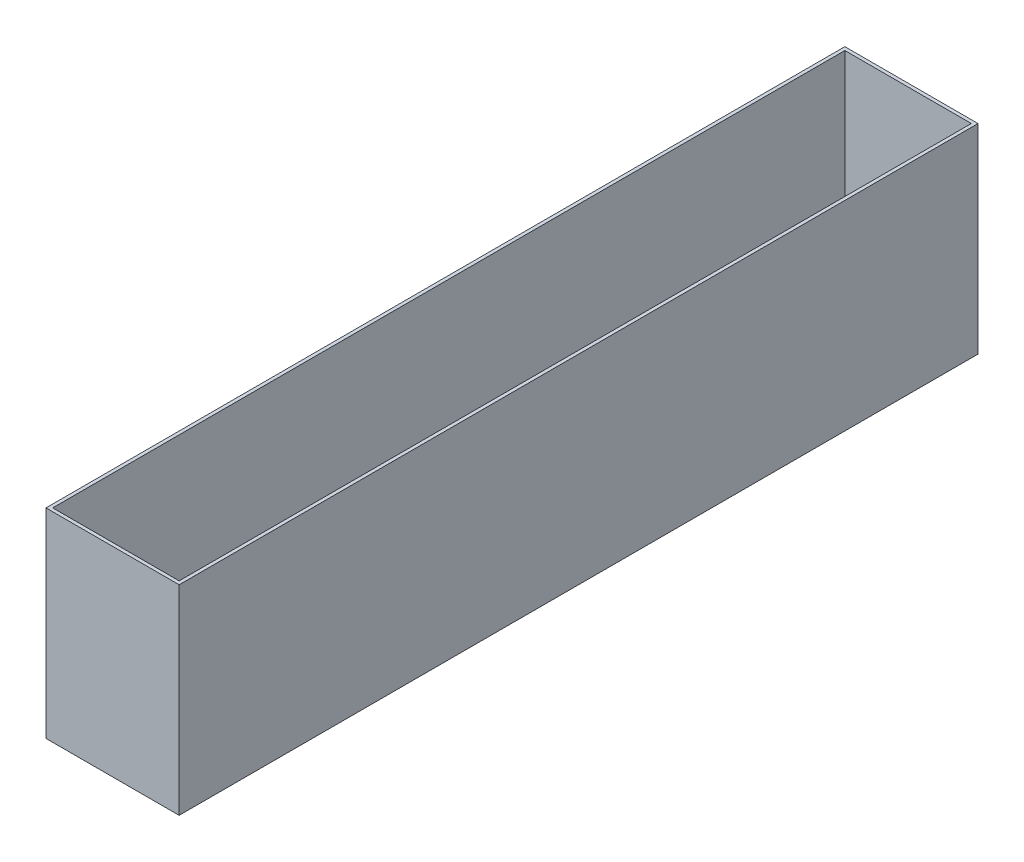
ISO-10303-21;
HEADER;
FILE_DESCRIPTION(('STEP AP214'),'2;1');
FILE_NAME('part.step','',(''),(''),'','','');
FILE_SCHEMA(('AUTOMOTIVE_DESIGN { 1 0 10303 214 1 1 1 1 }'));
ENDSEC;
DATA;
#1=APPLICATION_CONTEXT('core data for automotive mechanical design processes');
#2=APPLICATION_PROTOCOL_DEFINITION('international standard','automotive_design',2000,#1);
#3=PRODUCT_CONTEXT('',#1,'mechanical');
#4=PRODUCT('Part','Part','',(#3));
#5=PRODUCT_RELATED_PRODUCT_CATEGORY('part','',(#4));
#6=PRODUCT_DEFINITION_FORMATION('','',#4);
#7=PRODUCT_DEFINITION_CONTEXT('part definition',#1,'design');
#8=PRODUCT_DEFINITION('design','',#6,#7);
#9=PRODUCT_DEFINITION_SHAPE('','',#8);
#10=(LENGTH_UNIT() NAMED_UNIT(*) SI_UNIT(.MILLI.,.METRE.));
#11=(NAMED_UNIT(*) PLANE_ANGLE_UNIT() SI_UNIT($,.RADIAN.));
#12=(NAMED_UNIT(*) SI_UNIT($,.STERADIAN.) SOLID_ANGLE_UNIT());
#13=UNCERTAINTY_MEASURE_WITH_UNIT(LENGTH_MEASURE(1.E-05),#10,'distance_accuracy_value','');
#14=(GEOMETRIC_REPRESENTATION_CONTEXT(3) GLOBAL_UNCERTAINTY_ASSIGNED_CONTEXT((#13)) GLOBAL_UNIT_ASSIGNED_CONTEXT((#10,
#11,#12)) REPRESENTATION_CONTEXT('',''));
#15=CARTESIAN_POINT('',(0.,0.,0.));
#16=DIRECTION('',(0.,0.,1.));
#17=DIRECTION('',(1.,0.,0.));
#18=AXIS2_PLACEMENT_3D('',#15,#16,#17);
#19=CARTESIAN_POINT('',(0.,300.,0.));
#20=DIRECTION('',(1.,0.,0.));
#21=DIRECTION('',(0.,0.,-1.));
#22=AXIS2_PLACEMENT_3D('',#19,#20,#21);
#23=PLANE('',#22);
#24=DIRECTION('',(0.,0.,1.));
#25=VECTOR('',#24,1.);
#26=CARTESIAN_POINT('',(0.,0.,0.));
#27=LINE('',#26,#25);
#28=CARTESIAN_POINT('',(0.,0.,0.));
#29=VERTEX_POINT('',#28);
#30=CARTESIAN_POINT('',(1.46957615897682E-13,0.,1200.));
#31=VERTEX_POINT('',#30);
#32=EDGE_CURVE('E142',#29,#31,#27,.T.);
#33=ORIENTED_EDGE('',*,*,#32,.T.);
#34=DIRECTION('',(0.,-1.,0.));
#35=VECTOR('',#34,1.);
#36=CARTESIAN_POINT('',(1.46957615897682E-13,300.,1200.));
#37=LINE('',#36,#35);
#38=CARTESIAN_POINT('',(1.46957615897682E-13,300.,1200.));
#39=VERTEX_POINT('',#38);
#40=EDGE_CURVE('E11',#39,#31,#37,.T.);
#41=ORIENTED_EDGE('',*,*,#40,.F.);
#42=DIRECTION('',(0.,0.,1.));
#43=VECTOR('',#42,1.);
#44=CARTESIAN_POINT('',(0.,300.,0.));
#45=LINE('',#44,#43);
#46=CARTESIAN_POINT('',(0.,300.,0.));
#47=VERTEX_POINT('',#46);
#48=EDGE_CURVE('E146',#47,#39,#45,.T.);
#49=ORIENTED_EDGE('',*,*,#48,.F.);
#50=DIRECTION('',(0.,-1.,0.));
#51=VECTOR('',#50,1.);
#52=CARTESIAN_POINT('',(0.,300.,0.));
#53=LINE('',#52,#51);
#54=EDGE_CURVE('E152',#47,#29,#53,.T.);
#55=ORIENTED_EDGE('',*,*,#54,.T.);
#56=EDGE_LOOP('',(#33,#41,#49,#55));
#57=FACE_BOUND('',#56,.T.);
#58=ADVANCED_FACE('F34',(#57),#23,.F.);
#59=CARTESIAN_POINT('',(1.46957615897682E-13,300.,1200.));
#60=DIRECTION('',(0.,0.,-1.));
#61=DIRECTION('',(-1.,0.,0.));
#62=AXIS2_PLACEMENT_3D('',#59,#60,#61);
#63=PLANE('',#62);
#64=DIRECTION('',(1.,0.,0.));
#65=VECTOR('',#64,1.);
#66=CARTESIAN_POINT('',(1.46957615897682E-13,0.,1200.));
#67=LINE('',#66,#65);
#68=CARTESIAN_POINT('',(200.,0.,1200.));
#69=VERTEX_POINT('',#68);
#70=EDGE_CURVE('E155',#31,#69,#67,.T.);
#71=ORIENTED_EDGE('',*,*,#70,.T.);
#72=DIRECTION('',(0.,-1.,0.));
#73=VECTOR('',#72,1.);
#74=CARTESIAN_POINT('',(200.,300.,1200.));
#75=LINE('',#74,#73);
#76=CARTESIAN_POINT('',(200.,300.,1200.));
#77=VERTEX_POINT('',#76);
#78=EDGE_CURVE('E41',#77,#69,#75,.T.);
#79=ORIENTED_EDGE('',*,*,#78,.F.);
#80=DIRECTION('',(1.,0.,0.));
#81=VECTOR('',#80,1.);
#82=CARTESIAN_POINT('',(1.46957615897682E-13,300.,1200.));
#83=LINE('',#82,#81);
#84=EDGE_CURVE('E85',#39,#77,#83,.T.);
#85=ORIENTED_EDGE('',*,*,#84,.F.);
#86=ORIENTED_EDGE('',*,*,#40,.T.);
#87=EDGE_LOOP('',(#71,#79,#85,#86));
#88=FACE_BOUND('',#87,.T.);
#89=ADVANCED_FACE('F184',(#88),#63,.F.);
#90=CARTESIAN_POINT('',(200.,300.,0.));
#91=DIRECTION('',(-1.,0.,0.));
#92=DIRECTION('',(0.,0.,1.));
#93=AXIS2_PLACEMENT_3D('',#90,#91,#92);
#94=PLANE('',#93);
#95=DIRECTION('',(0.,0.,-1.));
#96=VECTOR('',#95,1.);
#97=CARTESIAN_POINT('',(200.,0.,0.));
#98=LINE('',#97,#96);
#99=CARTESIAN_POINT('',(200.,0.,0.));
#100=VERTEX_POINT('',#99);
#101=EDGE_CURVE('E157',#69,#100,#98,.T.);
#102=ORIENTED_EDGE('',*,*,#101,.T.);
#103=DIRECTION('',(0.,-1.,0.));
#104=VECTOR('',#103,1.);
#105=CARTESIAN_POINT('',(200.,300.,0.));
#106=LINE('',#105,#104);
#107=CARTESIAN_POINT('',(200.,300.,0.));
#108=VERTEX_POINT('',#107);
#109=EDGE_CURVE('E161',#108,#100,#106,.T.);
#110=ORIENTED_EDGE('',*,*,#109,.F.);
#111=DIRECTION('',(0.,0.,-1.));
#112=VECTOR('',#111,1.);
#113=CARTESIAN_POINT('',(200.,300.,0.));
#114=LINE('',#113,#112);
#115=EDGE_CURVE('E149',#77,#108,#114,.T.);
#116=ORIENTED_EDGE('',*,*,#115,.F.);
#117=ORIENTED_EDGE('',*,*,#78,.T.);
#118=EDGE_LOOP('',(#102,#110,#116,#117));
#119=FACE_BOUND('',#118,.T.);
#120=ADVANCED_FACE('F166',(#119),#94,.F.);
#121=CARTESIAN_POINT('',(0.,300.,0.));
#122=DIRECTION('',(0.,0.,1.));
#123=DIRECTION('',(1.,0.,0.));
#124=AXIS2_PLACEMENT_3D('',#121,#122,#123);
#125=PLANE('',#124);
#126=DIRECTION('',(-1.,0.,0.));
#127=VECTOR('',#126,1.);
#128=CARTESIAN_POINT('',(0.,0.,0.));
#129=LINE('',#128,#127);
#130=EDGE_CURVE('E78',#100,#29,#129,.T.);
#131=ORIENTED_EDGE('',*,*,#130,.T.);
#132=ORIENTED_EDGE('',*,*,#54,.F.);
#133=DIRECTION('',(-1.,0.,0.));
#134=VECTOR('',#133,1.);
#135=CARTESIAN_POINT('',(0.,300.,0.));
#136=LINE('',#135,#134);
#137=EDGE_CURVE('E57',#108,#47,#136,.T.);
#138=ORIENTED_EDGE('',*,*,#137,.F.);
#139=ORIENTED_EDGE('',*,*,#109,.T.);
#140=EDGE_LOOP('',(#131,#132,#138,#139));
#141=FACE_BOUND('',#140,.T.);
#142=ADVANCED_FACE('F174',(#141),#125,.F.);
#143=CARTESIAN_POINT('',(0.,300.,0.));
#144=DIRECTION('',(0.,1.,0.));
#145=DIRECTION('',(0.,0.,1.));
#146=AXIS2_PLACEMENT_3D('',#143,#144,#145);
#147=PLANE('',#146);
#148=DIRECTION('',(0.,0.,1.));
#149=VECTOR('',#148,1.);
#150=CARTESIAN_POINT('',(5.,300.,5.));
#151=LINE('',#150,#149);
#152=CARTESIAN_POINT('',(5.,300.,5.));
#153=VERTEX_POINT('',#152);
#154=CARTESIAN_POINT('',(5.00000000000015,300.,1195.));
#155=VERTEX_POINT('',#154);
#156=EDGE_CURVE('E48',#153,#155,#151,.T.);
#157=ORIENTED_EDGE('',*,*,#156,.F.);
#158=DIRECTION('',(-1.,0.,0.));
#159=VECTOR('',#158,1.);
#160=CARTESIAN_POINT('',(5.,300.,5.));
#161=LINE('',#160,#159);
#162=CARTESIAN_POINT('',(195.,300.,5.));
#163=VERTEX_POINT('',#162);
#164=EDGE_CURVE('E127',#163,#153,#161,.T.);
#165=ORIENTED_EDGE('',*,*,#164,.F.);
#166=DIRECTION('',(0.,0.,-1.));
#167=VECTOR('',#166,1.);
#168=CARTESIAN_POINT('',(195.,300.,5.));
#169=LINE('',#168,#167);
#170=CARTESIAN_POINT('',(195.,300.,1195.));
#171=VERTEX_POINT('',#170);
#172=EDGE_CURVE('E130',#171,#163,#169,.T.);
#173=ORIENTED_EDGE('',*,*,#172,.F.);
#174=DIRECTION('',(1.,0.,0.));
#175=VECTOR('',#174,1.);
#176=CARTESIAN_POINT('',(5.00000000000015,300.,1195.));
#177=LINE('',#176,#175);
#178=EDGE_CURVE('E136',#155,#171,#177,.T.);
#179=ORIENTED_EDGE('',*,*,#178,.F.);
#180=EDGE_LOOP('',(#157,#165,#173,#179));
#181=FACE_BOUND('',#180,.T.);
#182=ORIENTED_EDGE('',*,*,#48,.T.);
#183=ORIENTED_EDGE('',*,*,#84,.T.);
#184=ORIENTED_EDGE('',*,*,#115,.T.);
#185=ORIENTED_EDGE('',*,*,#137,.T.);
#186=EDGE_LOOP('',(#182,#183,#184,#185));
#187=FACE_BOUND('',#186,.T.);
#188=ADVANCED_FACE('F176',(#181,#187),#147,.T.);
#189=CARTESIAN_POINT('',(0.,0.,0.));
#190=DIRECTION('',(0.,1.,0.));
#191=DIRECTION('',(0.,0.,1.));
#192=AXIS2_PLACEMENT_3D('',#189,#190,#191);
#193=PLANE('',#192);
#194=ORIENTED_EDGE('',*,*,#32,.F.);
#195=ORIENTED_EDGE('',*,*,#130,.F.);
#196=ORIENTED_EDGE('',*,*,#101,.F.);
#197=ORIENTED_EDGE('',*,*,#70,.F.);
#198=EDGE_LOOP('',(#194,#195,#196,#197));
#199=FACE_BOUND('',#198,.T.);
#200=ADVANCED_FACE('F170',(#199),#193,.F.);
#201=CARTESIAN_POINT('',(5.,10.,5.));
#202=DIRECTION('',(-1.,0.,0.));
#203=DIRECTION('',(0.,0.,1.));
#204=AXIS2_PLACEMENT_3D('',#201,#202,#203);
#205=PLANE('',#204);
#206=ORIENTED_EDGE('',*,*,#156,.T.);
#207=DIRECTION('',(0.,1.,0.));
#208=VECTOR('',#207,1.);
#209=CARTESIAN_POINT('',(5.00000000000015,10.,1195.));
#210=LINE('',#209,#208);
#211=CARTESIAN_POINT('',(5.00000000000015,10.,1195.));
#212=VERTEX_POINT('',#211);
#213=EDGE_CURVE('E105',#212,#155,#210,.T.);
#214=ORIENTED_EDGE('',*,*,#213,.F.);
#215=DIRECTION('',(0.,0.,1.));
#216=VECTOR('',#215,1.);
#217=CARTESIAN_POINT('',(5.,10.,5.));
#218=LINE('',#217,#216);
#219=CARTESIAN_POINT('',(5.,10.,5.));
#220=VERTEX_POINT('',#219);
#221=EDGE_CURVE('E109',#220,#212,#218,.T.);
#222=ORIENTED_EDGE('',*,*,#221,.F.);
#223=DIRECTION('',(0.,1.,0.));
#224=VECTOR('',#223,1.);
#225=CARTESIAN_POINT('',(5.,10.,5.));
#226=LINE('',#225,#224);
#227=EDGE_CURVE('E140',#220,#153,#226,.T.);
#228=ORIENTED_EDGE('',*,*,#227,.T.);
#229=EDGE_LOOP('',(#206,#214,#222,#228));
#230=FACE_BOUND('',#229,.T.);
#231=ADVANCED_FACE('F107',(#230),#205,.F.);
#232=CARTESIAN_POINT('',(5.,10.,5.));
#233=DIRECTION('',(0.,0.,-1.));
#234=DIRECTION('',(-1.,0.,0.));
#235=AXIS2_PLACEMENT_3D('',#232,#233,#234);
#236=PLANE('',#235);
#237=ORIENTED_EDGE('',*,*,#164,.T.);
#238=ORIENTED_EDGE('',*,*,#227,.F.);
#239=DIRECTION('',(-1.,0.,0.));
#240=VECTOR('',#239,1.);
#241=CARTESIAN_POINT('',(5.,10.,5.));
#242=LINE('',#241,#240);
#243=CARTESIAN_POINT('',(195.,10.,5.));
#244=VERTEX_POINT('',#243);
#245=EDGE_CURVE('E115',#244,#220,#242,.T.);
#246=ORIENTED_EDGE('',*,*,#245,.F.);
#247=DIRECTION('',(0.,1.,0.));
#248=VECTOR('',#247,1.);
#249=CARTESIAN_POINT('',(195.,10.,5.));
#250=LINE('',#249,#248);
#251=EDGE_CURVE('E143',#244,#163,#250,.T.);
#252=ORIENTED_EDGE('',*,*,#251,.T.);
#253=EDGE_LOOP('',(#237,#238,#246,#252));
#254=FACE_BOUND('',#253,.T.);
#255=ADVANCED_FACE('F223',(#254),#236,.F.);
#256=CARTESIAN_POINT('',(195.,10.,5.));
#257=DIRECTION('',(1.,0.,0.));
#258=DIRECTION('',(0.,0.,-1.));
#259=AXIS2_PLACEMENT_3D('',#256,#257,#258);
#260=PLANE('',#259);
#261=ORIENTED_EDGE('',*,*,#172,.T.);
#262=ORIENTED_EDGE('',*,*,#251,.F.);
#263=DIRECTION('',(0.,0.,-1.));
#264=VECTOR('',#263,1.);
#265=CARTESIAN_POINT('',(195.,10.,5.));
#266=LINE('',#265,#264);
#267=CARTESIAN_POINT('',(195.,10.,1195.));
#268=VERTEX_POINT('',#267);
#269=EDGE_CURVE('E123',#268,#244,#266,.T.);
#270=ORIENTED_EDGE('',*,*,#269,.F.);
#271=DIRECTION('',(0.,1.,0.));
#272=VECTOR('',#271,1.);
#273=CARTESIAN_POINT('',(195.,10.,1195.));
#274=LINE('',#273,#272);
#275=EDGE_CURVE('E114',#268,#171,#274,.T.);
#276=ORIENTED_EDGE('',*,*,#275,.T.);
#277=EDGE_LOOP('',(#261,#262,#270,#276));
#278=FACE_BOUND('',#277,.T.);
#279=ADVANCED_FACE('F232',(#278),#260,.F.);
#280=CARTESIAN_POINT('',(5.00000000000015,10.,1195.));
#281=DIRECTION('',(0.,0.,1.));
#282=DIRECTION('',(1.,0.,0.));
#283=AXIS2_PLACEMENT_3D('',#280,#281,#282);
#284=PLANE('',#283);
#285=ORIENTED_EDGE('',*,*,#178,.T.);
#286=ORIENTED_EDGE('',*,*,#275,.F.);
#287=DIRECTION('',(1.,0.,0.));
#288=VECTOR('',#287,1.);
#289=CARTESIAN_POINT('',(5.00000000000015,10.,1195.));
#290=LINE('',#289,#288);
#291=EDGE_CURVE('E118',#212,#268,#290,.T.);
#292=ORIENTED_EDGE('',*,*,#291,.F.);
#293=ORIENTED_EDGE('',*,*,#213,.T.);
#294=EDGE_LOOP('',(#285,#286,#292,#293));
#295=FACE_BOUND('',#294,.T.);
#296=ADVANCED_FACE('F119',(#295),#284,.F.);
#297=CARTESIAN_POINT('',(0.,10.,0.));
#298=DIRECTION('',(0.,1.,0.));
#299=DIRECTION('',(0.,0.,1.));
#300=AXIS2_PLACEMENT_3D('',#297,#298,#299);
#301=PLANE('',#300);
#302=ORIENTED_EDGE('',*,*,#221,.T.);
#303=ORIENTED_EDGE('',*,*,#291,.T.);
#304=ORIENTED_EDGE('',*,*,#269,.T.);
#305=ORIENTED_EDGE('',*,*,#245,.T.);
#306=EDGE_LOOP('',(#302,#303,#304,#305));
#307=FACE_BOUND('',#306,.T.);
#308=ADVANCED_FACE('F125',(#307),#301,.T.);
#309=CLOSED_SHELL('',(#58,#89,#120,#142,#188,#200,#231,#255,#279,#296,#308));
#310=MANIFOLD_SOLID_BREP('B2',#309);
#311=ADVANCED_BREP_SHAPE_REPRESENTATION('',(#18,#310),#14);
#312=SHAPE_DEFINITION_REPRESENTATION(#9,#311);
ENDSEC;
END-ISO-10303-21;
